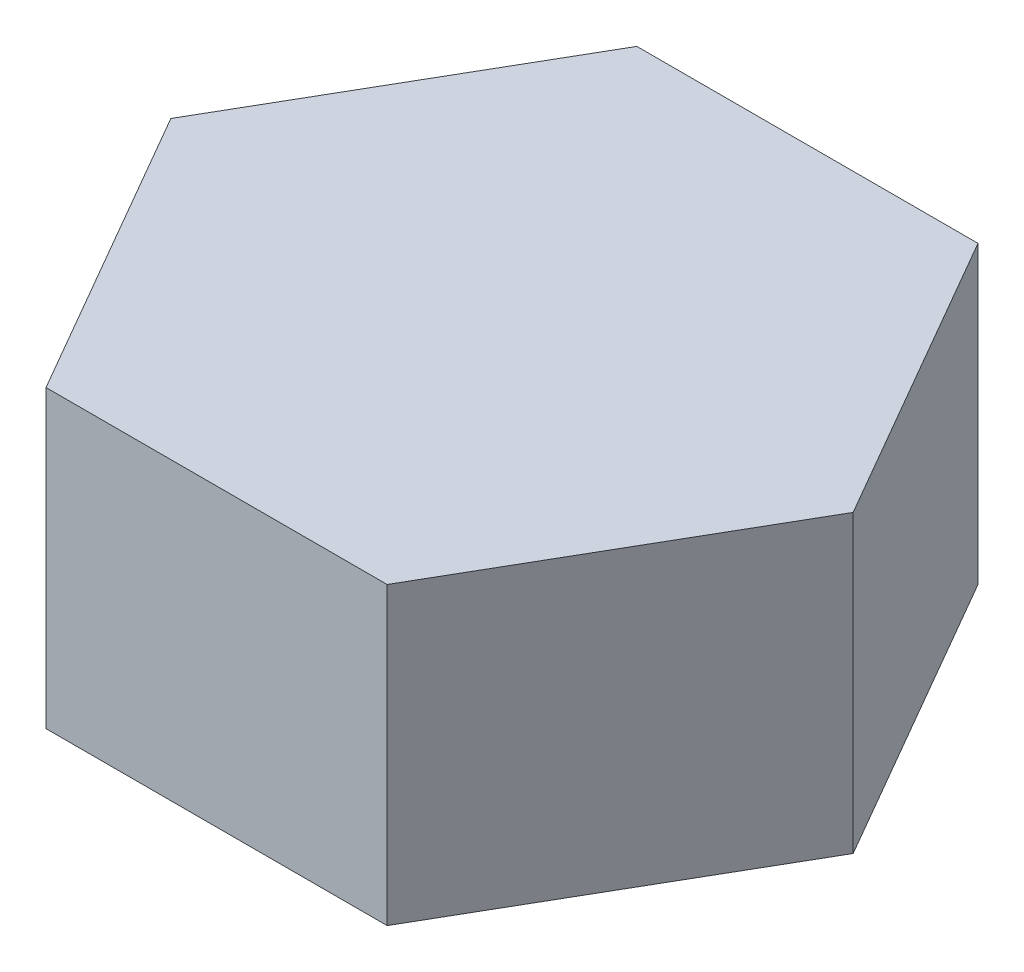
ISO-10303-21;
HEADER;
FILE_DESCRIPTION(('STEP AP214'),'2;1');
FILE_NAME('part.step','',(''),(''),'','','');
FILE_SCHEMA(('AUTOMOTIVE_DESIGN { 1 0 10303 214 1 1 1 1 }'));
ENDSEC;
DATA;
#1=APPLICATION_CONTEXT('core data for automotive mechanical design processes');
#2=APPLICATION_PROTOCOL_DEFINITION('international standard','automotive_design',2000,#1);
#3=PRODUCT_CONTEXT('',#1,'mechanical');
#4=PRODUCT('Part','Part','',(#3));
#5=PRODUCT_RELATED_PRODUCT_CATEGORY('part','',(#4));
#6=PRODUCT_DEFINITION_FORMATION('','',#4);
#7=PRODUCT_DEFINITION_CONTEXT('part definition',#1,'design');
#8=PRODUCT_DEFINITION('design','',#6,#7);
#9=PRODUCT_DEFINITION_SHAPE('','',#8);
#10=(LENGTH_UNIT() NAMED_UNIT(*) SI_UNIT(.MILLI.,.METRE.));
#11=(NAMED_UNIT(*) PLANE_ANGLE_UNIT() SI_UNIT($,.RADIAN.));
#12=(NAMED_UNIT(*) SI_UNIT($,.STERADIAN.) SOLID_ANGLE_UNIT());
#13=UNCERTAINTY_MEASURE_WITH_UNIT(LENGTH_MEASURE(1.E-05),#10,'distance_accuracy_value','');
#14=(GEOMETRIC_REPRESENTATION_CONTEXT(3) GLOBAL_UNCERTAINTY_ASSIGNED_CONTEXT((#13)) GLOBAL_UNIT_ASSIGNED_CONTEXT((#10,
#11,#12)) REPRESENTATION_CONTEXT('',''));
#15=CARTESIAN_POINT('',(0.,0.,0.));
#16=DIRECTION('',(0.,0.,1.));
#17=DIRECTION('',(1.,0.,0.));
#18=AXIS2_PLACEMENT_3D('',#15,#16,#17);
#19=CARTESIAN_POINT('',(5.77350269189626,-7.,10.));
#20=DIRECTION('',(0.866025403784439,0.,0.5));
#21=DIRECTION('',(0.5,0.,-0.866025403784439));
#22=AXIS2_PLACEMENT_3D('',#19,#20,#21);
#23=PLANE('',#22);
#24=DIRECTION('',(0.,1.,0.));
#25=VECTOR('',#24,1.);
#26=CARTESIAN_POINT('',(11.5470053837925,-7.,0.));
#27=LINE('',#26,#25);
#28=CARTESIAN_POINT('',(11.5470053837925,-7.,0.));
#29=VERTEX_POINT('',#28);
#30=CARTESIAN_POINT('',(11.5470053837925,3.,0.));
#31=VERTEX_POINT('',#30);
#32=EDGE_CURVE('E36',#29,#31,#27,.T.);
#33=ORIENTED_EDGE('',*,*,#32,.T.);
#34=DIRECTION('',(0.5,0.,-0.866025403784439));
#35=VECTOR('',#34,1.);
#36=CARTESIAN_POINT('',(5.77350269189626,3.,10.));
#37=LINE('',#36,#35);
#38=CARTESIAN_POINT('',(5.77350269189626,3.,10.));
#39=VERTEX_POINT('',#38);
#40=EDGE_CURVE('E85',#39,#31,#37,.T.);
#41=ORIENTED_EDGE('',*,*,#40,.F.);
#42=DIRECTION('',(0.,1.,0.));
#43=VECTOR('',#42,1.);
#44=CARTESIAN_POINT('',(5.77350269189626,-7.,10.));
#45=LINE('',#44,#43);
#46=CARTESIAN_POINT('',(5.77350269189626,-7.,10.));
#47=VERTEX_POINT('',#46);
#48=EDGE_CURVE('E11',#47,#39,#45,.T.);
#49=ORIENTED_EDGE('',*,*,#48,.F.);
#50=DIRECTION('',(0.5,0.,-0.866025403784439));
#51=VECTOR('',#50,1.);
#52=CARTESIAN_POINT('',(5.77350269189626,-7.,10.));
#53=LINE('',#52,#51);
#54=EDGE_CURVE('E86',#47,#29,#53,.T.);
#55=ORIENTED_EDGE('',*,*,#54,.T.);
#56=EDGE_LOOP('',(#33,#41,#49,#55));
#57=FACE_BOUND('',#56,.T.);
#58=ADVANCED_FACE('F33',(#57),#23,.T.);
#59=CARTESIAN_POINT('',(-5.77350269189625,-7.,10.));
#60=DIRECTION('',(0.,0.,1.));
#61=DIRECTION('',(1.,0.,0.));
#62=AXIS2_PLACEMENT_3D('',#59,#60,#61);
#63=PLANE('',#62);
#64=ORIENTED_EDGE('',*,*,#48,.T.);
#65=DIRECTION('',(1.,0.,0.));
#66=VECTOR('',#65,1.);
#67=CARTESIAN_POINT('',(-5.77350269189625,3.,10.));
#68=LINE('',#67,#66);
#69=CARTESIAN_POINT('',(-5.77350269189625,3.,10.));
#70=VERTEX_POINT('',#69);
#71=EDGE_CURVE('E103',#70,#39,#68,.T.);
#72=ORIENTED_EDGE('',*,*,#71,.F.);
#73=DIRECTION('',(0.,1.,0.));
#74=VECTOR('',#73,1.);
#75=CARTESIAN_POINT('',(-5.77350269189625,-7.,10.));
#76=LINE('',#75,#74);
#77=CARTESIAN_POINT('',(-5.77350269189625,-7.,10.));
#78=VERTEX_POINT('',#77);
#79=EDGE_CURVE('E41',#78,#70,#76,.T.);
#80=ORIENTED_EDGE('',*,*,#79,.F.);
#81=DIRECTION('',(1.,0.,0.));
#82=VECTOR('',#81,1.);
#83=CARTESIAN_POINT('',(-5.77350269189625,-7.,10.));
#84=LINE('',#83,#82);
#85=EDGE_CURVE('E91',#78,#47,#84,.T.);
#86=ORIENTED_EDGE('',*,*,#85,.T.);
#87=EDGE_LOOP('',(#64,#72,#80,#86));
#88=FACE_BOUND('',#87,.T.);
#89=ADVANCED_FACE('F143',(#88),#63,.T.);
#90=CARTESIAN_POINT('',(-11.5470053837925,-7.,0.));
#91=DIRECTION('',(-0.866025403784439,0.,0.5));
#92=DIRECTION('',(0.5,0.,0.866025403784439));
#93=AXIS2_PLACEMENT_3D('',#90,#91,#92);
#94=PLANE('',#93);
#95=ORIENTED_EDGE('',*,*,#79,.T.);
#96=DIRECTION('',(0.5,0.,0.866025403784439));
#97=VECTOR('',#96,1.);
#98=CARTESIAN_POINT('',(-11.5470053837925,3.,0.));
#99=LINE('',#98,#97);
#100=CARTESIAN_POINT('',(-11.5470053837925,3.,0.));
#101=VERTEX_POINT('',#100);
#102=EDGE_CURVE('E110',#101,#70,#99,.T.);
#103=ORIENTED_EDGE('',*,*,#102,.F.);
#104=DIRECTION('',(0.,1.,0.));
#105=VECTOR('',#104,1.);
#106=CARTESIAN_POINT('',(-11.5470053837925,-7.,0.));
#107=LINE('',#106,#105);
#108=CARTESIAN_POINT('',(-11.5470053837925,-7.,0.));
#109=VERTEX_POINT('',#108);
#110=EDGE_CURVE('E126',#109,#101,#107,.T.);
#111=ORIENTED_EDGE('',*,*,#110,.F.);
#112=DIRECTION('',(0.5,0.,0.866025403784439));
#113=VECTOR('',#112,1.);
#114=CARTESIAN_POINT('',(-11.5470053837925,-7.,0.));
#115=LINE('',#114,#113);
#116=EDGE_CURVE('E122',#109,#78,#115,.T.);
#117=ORIENTED_EDGE('',*,*,#116,.T.);
#118=EDGE_LOOP('',(#95,#103,#111,#117));
#119=FACE_BOUND('',#118,.T.);
#120=ADVANCED_FACE('F139',(#119),#94,.T.);
#121=CARTESIAN_POINT('',(-5.77350269189626,-7.,-9.99999999999999));
#122=DIRECTION('',(-0.866025403784439,0.,-0.5));
#123=DIRECTION('',(-0.5,0.,0.866025403784439));
#124=AXIS2_PLACEMENT_3D('',#121,#122,#123);
#125=PLANE('',#124);
#126=ORIENTED_EDGE('',*,*,#110,.T.);
#127=DIRECTION('',(-0.5,0.,0.866025403784439));
#128=VECTOR('',#127,1.);
#129=CARTESIAN_POINT('',(-5.77350269189626,3.,-9.99999999999999));
#130=LINE('',#129,#128);
#131=CARTESIAN_POINT('',(-5.77350269189626,3.,-9.99999999999999));
#132=VERTEX_POINT('',#131);
#133=EDGE_CURVE('E107',#132,#101,#130,.T.);
#134=ORIENTED_EDGE('',*,*,#133,.F.);
#135=DIRECTION('',(0.,1.,0.));
#136=VECTOR('',#135,1.);
#137=CARTESIAN_POINT('',(-5.77350269189626,-7.,-9.99999999999999));
#138=LINE('',#137,#136);
#139=CARTESIAN_POINT('',(-5.77350269189626,-7.,-9.99999999999999));
#140=VERTEX_POINT('',#139);
#141=EDGE_CURVE('E128',#140,#132,#138,.T.);
#142=ORIENTED_EDGE('',*,*,#141,.F.);
#143=DIRECTION('',(-0.5,0.,0.866025403784439));
#144=VECTOR('',#143,1.);
#145=CARTESIAN_POINT('',(-5.77350269189626,-7.,-9.99999999999999));
#146=LINE('',#145,#144);
#147=EDGE_CURVE('E119',#140,#109,#146,.T.);
#148=ORIENTED_EDGE('',*,*,#147,.T.);
#149=EDGE_LOOP('',(#126,#134,#142,#148));
#150=FACE_BOUND('',#149,.T.);
#151=ADVANCED_FACE('F136',(#150),#125,.T.);
#152=CARTESIAN_POINT('',(5.77350269189626,-7.,-9.99999999999999));
#153=DIRECTION('',(0.,0.,-1.));
#154=DIRECTION('',(-1.,0.,0.));
#155=AXIS2_PLACEMENT_3D('',#152,#153,#154);
#156=PLANE('',#155);
#157=ORIENTED_EDGE('',*,*,#141,.T.);
#158=DIRECTION('',(-1.,0.,0.));
#159=VECTOR('',#158,1.);
#160=CARTESIAN_POINT('',(5.77350269189626,3.,-9.99999999999999));
#161=LINE('',#160,#159);
#162=CARTESIAN_POINT('',(5.77350269189626,3.,-9.99999999999999));
#163=VERTEX_POINT('',#162);
#164=EDGE_CURVE('E98',#163,#132,#161,.T.);
#165=ORIENTED_EDGE('',*,*,#164,.F.);
#166=DIRECTION('',(0.,1.,0.));
#167=VECTOR('',#166,1.);
#168=CARTESIAN_POINT('',(5.77350269189626,-7.,-9.99999999999999));
#169=LINE('',#168,#167);
#170=CARTESIAN_POINT('',(5.77350269189626,-7.,-9.99999999999999));
#171=VERTEX_POINT('',#170);
#172=EDGE_CURVE('E90',#171,#163,#169,.T.);
#173=ORIENTED_EDGE('',*,*,#172,.F.);
#174=DIRECTION('',(-1.,0.,0.));
#175=VECTOR('',#174,1.);
#176=CARTESIAN_POINT('',(5.77350269189626,-7.,-9.99999999999999));
#177=LINE('',#176,#175);
#178=EDGE_CURVE('E116',#171,#140,#177,.T.);
#179=ORIENTED_EDGE('',*,*,#178,.T.);
#180=EDGE_LOOP('',(#157,#165,#173,#179));
#181=FACE_BOUND('',#180,.T.);
#182=ADVANCED_FACE('F130',(#181),#156,.T.);
#183=CARTESIAN_POINT('',(11.5470053837925,-7.,0.));
#184=DIRECTION('',(0.866025403784439,0.,-0.5));
#185=DIRECTION('',(-0.5,0.,-0.866025403784439));
#186=AXIS2_PLACEMENT_3D('',#183,#184,#185);
#187=PLANE('',#186);
#188=ORIENTED_EDGE('',*,*,#172,.T.);
#189=DIRECTION('',(-0.5,0.,-0.866025403784439));
#190=VECTOR('',#189,1.);
#191=CARTESIAN_POINT('',(11.5470053837925,3.,0.));
#192=LINE('',#191,#190);
#193=EDGE_CURVE('E93',#31,#163,#192,.T.);
#194=ORIENTED_EDGE('',*,*,#193,.F.);
#195=ORIENTED_EDGE('',*,*,#32,.F.);
#196=DIRECTION('',(-0.5,0.,-0.866025403784439));
#197=VECTOR('',#196,1.);
#198=CARTESIAN_POINT('',(11.5470053837925,-7.,0.));
#199=LINE('',#198,#197);
#200=EDGE_CURVE('E114',#29,#171,#199,.T.);
#201=ORIENTED_EDGE('',*,*,#200,.T.);
#202=EDGE_LOOP('',(#188,#194,#195,#201));
#203=FACE_BOUND('',#202,.T.);
#204=ADVANCED_FACE('F94',(#203),#187,.T.);
#205=CARTESIAN_POINT('',(0.,-7.,0.));
#206=DIRECTION('',(0.,1.,0.));
#207=DIRECTION('',(0.,0.,1.));
#208=AXIS2_PLACEMENT_3D('',#205,#206,#207);
#209=PLANE('',#208);
#210=ORIENTED_EDGE('',*,*,#54,.F.);
#211=ORIENTED_EDGE('',*,*,#85,.F.);
#212=ORIENTED_EDGE('',*,*,#116,.F.);
#213=ORIENTED_EDGE('',*,*,#147,.F.);
#214=ORIENTED_EDGE('',*,*,#178,.F.);
#215=ORIENTED_EDGE('',*,*,#200,.F.);
#216=EDGE_LOOP('',(#210,#211,#212,#213,#214,#215));
#217=FACE_BOUND('',#216,.T.);
#218=ADVANCED_FACE('F142',(#217),#209,.F.);
#219=CARTESIAN_POINT('',(0.,3.,0.));
#220=DIRECTION('',(0.,1.,0.));
#221=DIRECTION('',(0.,0.,1.));
#222=AXIS2_PLACEMENT_3D('',#219,#220,#221);
#223=PLANE('',#222);
#224=ORIENTED_EDGE('',*,*,#40,.T.);
#225=ORIENTED_EDGE('',*,*,#193,.T.);
#226=ORIENTED_EDGE('',*,*,#164,.T.);
#227=ORIENTED_EDGE('',*,*,#133,.T.);
#228=ORIENTED_EDGE('',*,*,#102,.T.);
#229=ORIENTED_EDGE('',*,*,#71,.T.);
#230=EDGE_LOOP('',(#224,#225,#226,#227,#228,#229));
#231=FACE_BOUND('',#230,.T.);
#232=ADVANCED_FACE('F101',(#231),#223,.T.);
#233=CLOSED_SHELL('',(#58,#89,#120,#151,#182,#204,#218,#232));
#234=MANIFOLD_SOLID_BREP('B2',#233);
#235=ADVANCED_BREP_SHAPE_REPRESENTATION('',(#18,#234),#14);
#236=SHAPE_DEFINITION_REPRESENTATION(#9,#235);
ENDSEC;
END-ISO-10303-21;
